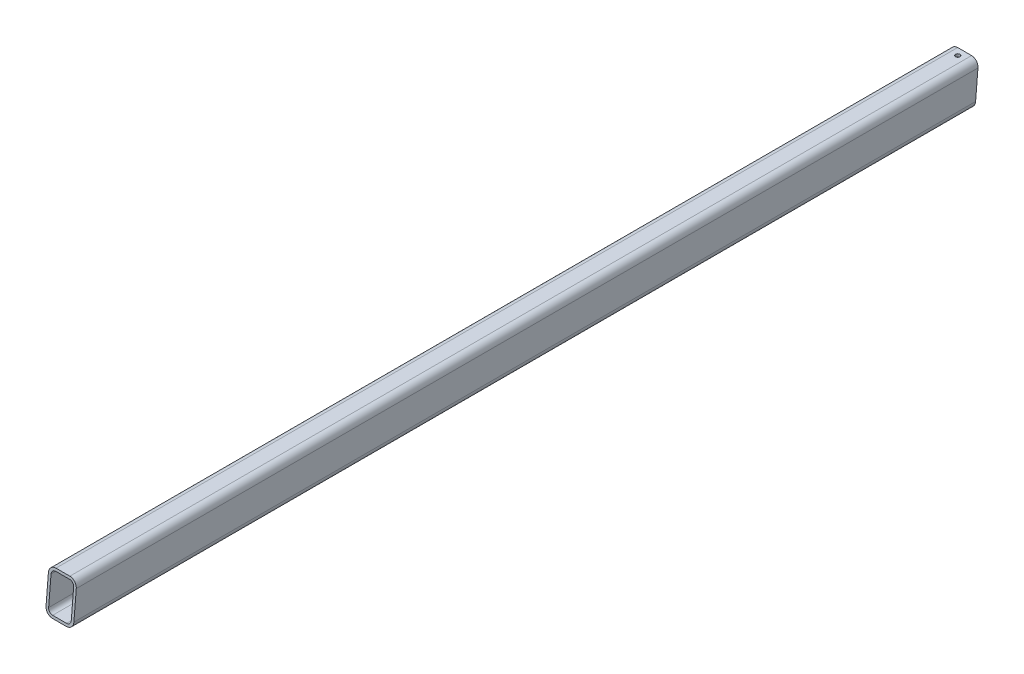
ISO-10303-21;
HEADER;
FILE_DESCRIPTION(('STEP AP214'),'2;1');
FILE_NAME('part.step','',(''),(''),'','','');
FILE_SCHEMA(('AUTOMOTIVE_DESIGN { 1 0 10303 214 1 1 1 1 }'));
ENDSEC;
DATA;
#1=APPLICATION_CONTEXT('core data for automotive mechanical design processes');
#2=APPLICATION_PROTOCOL_DEFINITION('international standard','automotive_design',2000,#1);
#3=PRODUCT_CONTEXT('',#1,'mechanical');
#4=PRODUCT('Part','Part','',(#3));
#5=PRODUCT_RELATED_PRODUCT_CATEGORY('part','',(#4));
#6=PRODUCT_DEFINITION_FORMATION('','',#4);
#7=PRODUCT_DEFINITION_CONTEXT('part definition',#1,'design');
#8=PRODUCT_DEFINITION('design','',#6,#7);
#9=PRODUCT_DEFINITION_SHAPE('','',#8);
#10=(LENGTH_UNIT() NAMED_UNIT(*) SI_UNIT(.MILLI.,.METRE.));
#11=(NAMED_UNIT(*) PLANE_ANGLE_UNIT() SI_UNIT($,.RADIAN.));
#12=(NAMED_UNIT(*) SI_UNIT($,.STERADIAN.) SOLID_ANGLE_UNIT());
#13=UNCERTAINTY_MEASURE_WITH_UNIT(LENGTH_MEASURE(1.E-05),#10,'distance_accuracy_value','');
#14=(GEOMETRIC_REPRESENTATION_CONTEXT(3) GLOBAL_UNCERTAINTY_ASSIGNED_CONTEXT((#13)) GLOBAL_UNIT_ASSIGNED_CONTEXT((#10,
#11,#12)) REPRESENTATION_CONTEXT('',''));
#15=CARTESIAN_POINT('',(0.,0.,0.));
#16=DIRECTION('',(0.,0.,1.));
#17=DIRECTION('',(1.,0.,0.));
#18=AXIS2_PLACEMENT_3D('',#15,#16,#17);
#19=CARTESIAN_POINT('',(-12.7,38.1,838.2));
#20=DIRECTION('',(0.,-1.,0.));
#21=DIRECTION('',(0.,0.,-1.));
#22=AXIS2_PLACEMENT_3D('',#19,#20,#21);
#23=PLANE('',#22);
#24=DIRECTION('',(0.,0.,-1.));
#25=VECTOR('',#24,1.);
#26=CARTESIAN_POINT('',(12.7,38.1,838.2));
#27=LINE('',#26,#25);
#28=CARTESIAN_POINT('',(12.7,38.1,818.873869568707));
#29=VERTEX_POINT('',#28);
#30=CARTESIAN_POINT('',(12.7,38.1,-825.371543987311));
#31=VERTEX_POINT('',#30);
#32=EDGE_CURVE('E215',#29,#31,#27,.T.);
#33=ORIENTED_EDGE('',*,*,#32,.T.);
#34=DIRECTION('',(-1.,0.,0.));
#35=VECTOR('',#34,1.);
#36=CARTESIAN_POINT('',(-12.7,38.1,-825.371543987311));
#37=LINE('',#36,#35);
#38=CARTESIAN_POINT('',(-12.7,38.1,-825.371543987311));
#39=VERTEX_POINT('',#38);
#40=EDGE_CURVE('E257',#31,#39,#37,.T.);
#41=ORIENTED_EDGE('',*,*,#40,.T.);
#42=DIRECTION('',(0.,0.,-1.));
#43=VECTOR('',#42,1.);
#44=CARTESIAN_POINT('',(-12.7,38.1,838.2));
#45=LINE('',#44,#43);
#46=CARTESIAN_POINT('',(-12.7,38.1,818.873869568707));
#47=VERTEX_POINT('',#46);
#48=EDGE_CURVE('E212',#47,#39,#45,.T.);
#49=ORIENTED_EDGE('',*,*,#48,.F.);
#50=DIRECTION('',(1.,0.,0.));
#51=VECTOR('',#50,1.);
#52=CARTESIAN_POINT('',(-12.7,38.1,818.873869568707));
#53=LINE('',#52,#51);
#54=EDGE_CURVE('E175',#47,#29,#53,.T.);
#55=ORIENTED_EDGE('',*,*,#54,.T.);
#56=EDGE_LOOP('',(#33,#41,#49,#55));
#57=FACE_BOUND('',#56,.T.);
#58=CARTESIAN_POINT('',(0.,38.1,-812.8));
#59=DIRECTION('',(0.,1.,0.));
#60=DIRECTION('',(0.,0.,1.));
#61=AXIS2_PLACEMENT_3D('',#58,#59,#60);
#62=CIRCLE('',#61,3.9751);
#63=CARTESIAN_POINT('',(0.,38.1,-816.7751));
#64=VERTEX_POINT('',#63);
#65=EDGE_CURVE('E230',#64,#64,#62,.T.);
#66=ORIENTED_EDGE('',*,*,#65,.F.);
#67=EDGE_LOOP('',(#66));
#68=FACE_BOUND('',#67,.T.);
#69=ADVANCED_FACE('F36',(#57,#68),#23,.F.);
#70=CARTESIAN_POINT('',(-12.7,33.3248,838.2));
#71=DIRECTION('',(0.,-1.,0.));
#72=DIRECTION('',(1.,0.,0.));
#73=AXIS2_PLACEMENT_3D('',#70,#71,#72);
#74=PLANE('',#73);
#75=DIRECTION('',(-1.,0.,0.));
#76=VECTOR('',#75,1.);
#77=CARTESIAN_POINT('',(-12.7,33.3248,-824.964356390412));
#78=LINE('',#77,#76);
#79=CARTESIAN_POINT('',(12.7,33.3248,-824.964356390412));
#80=VERTEX_POINT('',#79);
#81=CARTESIAN_POINT('',(-12.7,33.3248,-824.964356390412));
#82=VERTEX_POINT('',#81);
#83=EDGE_CURVE('E11',#80,#82,#78,.T.);
#84=ORIENTED_EDGE('',*,*,#83,.F.);
#85=DIRECTION('',(0.,0.,-1.));
#86=VECTOR('',#85,1.);
#87=CARTESIAN_POINT('',(12.7,33.3248,838.2));
#88=LINE('',#87,#86);
#89=CARTESIAN_POINT('',(12.7,33.3248,819.281057165606));
#90=VERTEX_POINT('',#89);
#91=EDGE_CURVE('E169',#90,#80,#88,.T.);
#92=ORIENTED_EDGE('',*,*,#91,.F.);
#93=DIRECTION('',(1.,0.,0.));
#94=VECTOR('',#93,1.);
#95=CARTESIAN_POINT('',(-12.7,33.3248,819.281057165606));
#96=LINE('',#95,#94);
#97=CARTESIAN_POINT('',(-12.7,33.3248,819.281057165606));
#98=VERTEX_POINT('',#97);
#99=EDGE_CURVE('E45',#98,#90,#96,.T.);
#100=ORIENTED_EDGE('',*,*,#99,.F.);
#101=DIRECTION('',(0.,0.,-1.));
#102=VECTOR('',#101,1.);
#103=CARTESIAN_POINT('',(-12.7,33.3248,838.2));
#104=LINE('',#103,#102);
#105=EDGE_CURVE('E160',#98,#82,#104,.T.);
#106=ORIENTED_EDGE('',*,*,#105,.T.);
#107=EDGE_LOOP('',(#84,#92,#100,#106));
#108=FACE_BOUND('',#107,.T.);
#109=CARTESIAN_POINT('',(0.,33.3248,-812.8));
#110=DIRECTION('',(0.,-1.,0.));
#111=DIRECTION('',(1.,0.,0.));
#112=AXIS2_PLACEMENT_3D('',#109,#110,#111);
#113=CIRCLE('',#112,3.9751);
#114=CARTESIAN_POINT('',(0.,33.3248,-816.7751));
#115=VERTEX_POINT('',#114);
#116=EDGE_CURVE('E40',#115,#115,#113,.F.);
#117=ORIENTED_EDGE('',*,*,#116,.T.);
#118=EDGE_LOOP('',(#117));
#119=FACE_BOUND('',#118,.T.);
#120=ADVANCED_FACE('F167',(#108,#119),#74,.T.);
#121=CARTESIAN_POINT('',(12.7,25.4,838.2));
#122=DIRECTION('',(0.,0.,-1.));
#123=DIRECTION('',(-1.,0.,0.));
#124=AXIS2_PLACEMENT_3D('',#121,#122,#123);
#125=CYLINDRICAL_SURFACE('',#124,12.7);
#126=DIRECTION('',(0.,0.,-1.));
#127=VECTOR('',#126,1.);
#128=CARTESIAN_POINT('',(25.4,25.4,838.2));
#129=LINE('',#128,#127);
#130=CARTESIAN_POINT('',(25.4,25.4,819.956815305141));
#131=VERTEX_POINT('',#130);
#132=CARTESIAN_POINT('',(25.4,25.4,-824.288598250877));
#133=VERTEX_POINT('',#132);
#134=EDGE_CURVE('E194',#131,#133,#129,.T.);
#135=ORIENTED_EDGE('',*,*,#134,.T.);
#136=CARTESIAN_POINT('',(12.7,25.4,-824.288598250877));
#137=DIRECTION('',(0.,0.0849629859680558,0.996384108170836));
#138=DIRECTION('',(0.,0.996384108170836,-0.0849629859680559));
#139=AXIS2_PLACEMENT_3D('',#136,#137,#138);
#140=ELLIPSE('',#139,12.7460884771784,12.7);
#141=EDGE_CURVE('E53',#133,#31,#140,.T.);
#142=ORIENTED_EDGE('',*,*,#141,.T.);
#143=ORIENTED_EDGE('',*,*,#32,.F.);
#144=CARTESIAN_POINT('',(12.7,25.4,819.956815305141));
#145=DIRECTION('',(0.,-0.0849629859680556,-0.996384108170836));
#146=DIRECTION('',(0.,0.996384108170836,-0.0849629859680556));
#147=AXIS2_PLACEMENT_3D('',#144,#145,#146);
#148=ELLIPSE('',#147,12.7460884771784,12.7);
#149=EDGE_CURVE('E170',#29,#131,#148,.T.);
#150=ORIENTED_EDGE('',*,*,#149,.T.);
#151=EDGE_LOOP('',(#135,#142,#143,#150));
#152=FACE_BOUND('',#151,.T.);
#153=ADVANCED_FACE('F38',(#152),#125,.T.);
#154=CARTESIAN_POINT('',(-12.7,25.4,838.2));
#155=DIRECTION('',(0.,0.,-1.));
#156=DIRECTION('',(-1.,0.,0.));
#157=AXIS2_PLACEMENT_3D('',#154,#155,#156);
#158=CYLINDRICAL_SURFACE('',#157,12.7);
#159=ORIENTED_EDGE('',*,*,#48,.T.);
#160=CARTESIAN_POINT('',(-12.7,25.4,-824.288598250877));
#161=DIRECTION('',(0.,0.0849629859680558,0.996384108170836));
#162=DIRECTION('',(0.,0.996384108170836,-0.0849629859680559));
#163=AXIS2_PLACEMENT_3D('',#160,#161,#162);
#164=ELLIPSE('',#163,12.7460884771784,12.7);
#165=CARTESIAN_POINT('',(-25.4,25.4,-824.288598250877));
#166=VERTEX_POINT('',#165);
#167=EDGE_CURVE('E254',#39,#166,#164,.T.);
#168=ORIENTED_EDGE('',*,*,#167,.T.);
#169=DIRECTION('',(0.,0.,-1.));
#170=VECTOR('',#169,1.);
#171=CARTESIAN_POINT('',(-25.4,25.4,838.2));
#172=LINE('',#171,#170);
#173=CARTESIAN_POINT('',(-25.4,25.4,819.956815305141));
#174=VERTEX_POINT('',#173);
#175=EDGE_CURVE('E209',#174,#166,#172,.T.);
#176=ORIENTED_EDGE('',*,*,#175,.F.);
#177=CARTESIAN_POINT('',(-12.7,25.4,819.956815305141));
#178=DIRECTION('',(0.,-0.0849629859680556,-0.996384108170836));
#179=DIRECTION('',(0.,0.996384108170836,-0.0849629859680556));
#180=AXIS2_PLACEMENT_3D('',#177,#178,#179);
#181=ELLIPSE('',#180,12.7460884771784,12.7);
#182=EDGE_CURVE('E290',#174,#47,#181,.T.);
#183=ORIENTED_EDGE('',*,*,#182,.T.);
#184=EDGE_LOOP('',(#159,#168,#176,#183));
#185=FACE_BOUND('',#184,.T.);
#186=ADVANCED_FACE('F316',(#185),#158,.T.);
#187=CARTESIAN_POINT('',(-25.4,25.4,838.2));
#188=DIRECTION('',(1.,0.,0.));
#189=DIRECTION('',(0.,0.,-1.));
#190=AXIS2_PLACEMENT_3D('',#187,#188,#189);
#191=PLANE('',#190);
#192=ORIENTED_EDGE('',*,*,#175,.T.);
#193=DIRECTION('',(0.,-0.996384108170836,0.0849629859680559));
#194=VECTOR('',#193,1.);
#195=CARTESIAN_POINT('',(-25.4,-115.339250740842,-812.287576869875));
#196=LINE('',#195,#194);
#197=CARTESIAN_POINT('',(-25.4,-25.4,-819.95681530514));
#198=VERTEX_POINT('',#197);
#199=EDGE_CURVE('E251',#166,#198,#196,.T.);
#200=ORIENTED_EDGE('',*,*,#199,.T.);
#201=DIRECTION('',(0.,0.,-1.));
#202=VECTOR('',#201,1.);
#203=CARTESIAN_POINT('',(-25.4,-25.4,838.2));
#204=LINE('',#203,#202);
#205=CARTESIAN_POINT('',(-25.4,-25.4,824.288598250877));
#206=VERTEX_POINT('',#205);
#207=EDGE_CURVE('E206',#206,#198,#204,.T.);
#208=ORIENTED_EDGE('',*,*,#207,.F.);
#209=DIRECTION('',(0.,0.996384108170836,-0.0849629859680556));
#210=VECTOR('',#209,1.);
#211=CARTESIAN_POINT('',(-25.4,23.8556091706237,820.088507546405));
#212=LINE('',#211,#210);
#213=EDGE_CURVE('E287',#206,#174,#212,.T.);
#214=ORIENTED_EDGE('',*,*,#213,.T.);
#215=EDGE_LOOP('',(#192,#200,#208,#214));
#216=FACE_BOUND('',#215,.T.);
#217=ADVANCED_FACE('F313',(#216),#191,.F.);
#218=CARTESIAN_POINT('',(-12.7,-25.4,838.2));
#219=DIRECTION('',(0.,0.,-1.));
#220=DIRECTION('',(-1.,0.,0.));
#221=AXIS2_PLACEMENT_3D('',#218,#219,#220);
#222=CYLINDRICAL_SURFACE('',#221,12.7);
#223=ORIENTED_EDGE('',*,*,#207,.T.);
#224=CARTESIAN_POINT('',(-12.7,-25.4,-819.95681530514));
#225=DIRECTION('',(0.,0.0849629859680558,0.996384108170836));
#226=DIRECTION('',(0.,0.996384108170836,-0.0849629859680559));
#227=AXIS2_PLACEMENT_3D('',#224,#225,#226);
#228=ELLIPSE('',#227,12.7460884771784,12.7);
#229=CARTESIAN_POINT('',(-12.7,-38.1,-818.873869568706));
#230=VERTEX_POINT('',#229);
#231=EDGE_CURVE('E248',#198,#230,#228,.T.);
#232=ORIENTED_EDGE('',*,*,#231,.T.);
#233=DIRECTION('',(0.,0.,-1.));
#234=VECTOR('',#233,1.);
#235=CARTESIAN_POINT('',(-12.7,-38.1,838.2));
#236=LINE('',#235,#234);
#237=CARTESIAN_POINT('',(-12.7,-38.1,825.371543987311));
#238=VERTEX_POINT('',#237);
#239=EDGE_CURVE('E203',#238,#230,#236,.T.);
#240=ORIENTED_EDGE('',*,*,#239,.F.);
#241=CARTESIAN_POINT('',(-12.7,-25.4,824.288598250877));
#242=DIRECTION('',(0.,-0.0849629859680556,-0.996384108170836));
#243=DIRECTION('',(0.,0.996384108170836,-0.0849629859680556));
#244=AXIS2_PLACEMENT_3D('',#241,#242,#243);
#245=ELLIPSE('',#244,12.7460884771784,12.7);
#246=EDGE_CURVE('E284',#238,#206,#245,.T.);
#247=ORIENTED_EDGE('',*,*,#246,.T.);
#248=EDGE_LOOP('',(#223,#232,#240,#247));
#249=FACE_BOUND('',#248,.T.);
#250=ADVANCED_FACE('F310',(#249),#222,.T.);
#251=CARTESIAN_POINT('',(-12.7,-38.1,838.2));
#252=DIRECTION('',(0.,1.,0.));
#253=DIRECTION('',(0.,0.,1.));
#254=AXIS2_PLACEMENT_3D('',#251,#252,#253);
#255=PLANE('',#254);
#256=CARTESIAN_POINT('',(0.,-38.1,-806.45));
#257=DIRECTION('',(0.,1.,0.));
#258=DIRECTION('',(0.,0.,1.));
#259=AXIS2_PLACEMENT_3D('',#256,#257,#258);
#260=CIRCLE('',#259,3.97510000000001);
#261=CARTESIAN_POINT('',(0.,-38.1,-802.4749));
#262=VERTEX_POINT('',#261);
#263=EDGE_CURVE('E220',#262,#262,#260,.T.);
#264=ORIENTED_EDGE('',*,*,#263,.T.);
#265=EDGE_LOOP('',(#264));
#266=FACE_BOUND('',#265,.T.);
#267=ORIENTED_EDGE('',*,*,#239,.T.);
#268=DIRECTION('',(1.,0.,0.));
#269=VECTOR('',#268,1.);
#270=CARTESIAN_POINT('',(-12.7,-38.1,-818.873869568706));
#271=LINE('',#270,#269);
#272=CARTESIAN_POINT('',(12.7,-38.1,-818.873869568706));
#273=VERTEX_POINT('',#272);
#274=EDGE_CURVE('E245',#230,#273,#271,.T.);
#275=ORIENTED_EDGE('',*,*,#274,.T.);
#276=DIRECTION('',(0.,0.,-1.));
#277=VECTOR('',#276,1.);
#278=CARTESIAN_POINT('',(12.7,-38.1,838.2));
#279=LINE('',#278,#277);
#280=CARTESIAN_POINT('',(12.7,-38.1,825.371543987311));
#281=VERTEX_POINT('',#280);
#282=EDGE_CURVE('E200',#281,#273,#279,.T.);
#283=ORIENTED_EDGE('',*,*,#282,.F.);
#284=DIRECTION('',(-1.,0.,0.));
#285=VECTOR('',#284,1.);
#286=CARTESIAN_POINT('',(-12.7,-38.1,825.371543987311));
#287=LINE('',#286,#285);
#288=EDGE_CURVE('E281',#281,#238,#287,.T.);
#289=ORIENTED_EDGE('',*,*,#288,.T.);
#290=EDGE_LOOP('',(#267,#275,#283,#289));
#291=FACE_BOUND('',#290,.T.);
#292=ADVANCED_FACE('F307',(#266,#291),#255,.F.);
#293=CARTESIAN_POINT('',(12.7,-25.4,838.2));
#294=DIRECTION('',(0.,0.,-1.));
#295=DIRECTION('',(-1.,0.,0.));
#296=AXIS2_PLACEMENT_3D('',#293,#294,#295);
#297=CYLINDRICAL_SURFACE('',#296,12.7);
#298=ORIENTED_EDGE('',*,*,#282,.T.);
#299=CARTESIAN_POINT('',(12.7,-25.4,-819.95681530514));
#300=DIRECTION('',(0.,0.0849629859680558,0.996384108170836));
#301=DIRECTION('',(0.,0.996384108170836,-0.0849629859680559));
#302=AXIS2_PLACEMENT_3D('',#299,#300,#301);
#303=ELLIPSE('',#302,12.7460884771784,12.7);
#304=CARTESIAN_POINT('',(25.4,-25.4,-819.956815305141));
#305=VERTEX_POINT('',#304);
#306=EDGE_CURVE('E242',#273,#305,#303,.T.);
#307=ORIENTED_EDGE('',*,*,#306,.T.);
#308=DIRECTION('',(0.,0.,-1.));
#309=VECTOR('',#308,1.);
#310=CARTESIAN_POINT('',(25.4,-25.4,838.2));
#311=LINE('',#310,#309);
#312=CARTESIAN_POINT('',(25.4,-25.4,824.288598250877));
#313=VERTEX_POINT('',#312);
#314=EDGE_CURVE('E197',#313,#305,#311,.T.);
#315=ORIENTED_EDGE('',*,*,#314,.F.);
#316=CARTESIAN_POINT('',(12.7,-25.4,824.288598250877));
#317=DIRECTION('',(0.,-0.0849629859680556,-0.996384108170836));
#318=DIRECTION('',(0.,0.996384108170836,-0.0849629859680556));
#319=AXIS2_PLACEMENT_3D('',#316,#317,#318);
#320=ELLIPSE('',#319,12.7460884771784,12.7);
#321=EDGE_CURVE('E278',#313,#281,#320,.T.);
#322=ORIENTED_EDGE('',*,*,#321,.T.);
#323=EDGE_LOOP('',(#298,#307,#315,#322));
#324=FACE_BOUND('',#323,.T.);
#325=ADVANCED_FACE('F304',(#324),#297,.T.);
#326=CARTESIAN_POINT('',(25.4,25.4,838.2));
#327=DIRECTION('',(-1.,0.,0.));
#328=DIRECTION('',(0.,0.,1.));
#329=AXIS2_PLACEMENT_3D('',#326,#327,#328);
#330=PLANE('',#329);
#331=ORIENTED_EDGE('',*,*,#314,.T.);
#332=DIRECTION('',(0.,0.996384108170836,-0.0849629859680559));
#333=VECTOR('',#332,1.);
#334=CARTESIAN_POINT('',(25.4,-115.339250740842,-812.287576869875));
#335=LINE('',#334,#333);
#336=EDGE_CURVE('E163',#305,#133,#335,.T.);
#337=ORIENTED_EDGE('',*,*,#336,.T.);
#338=ORIENTED_EDGE('',*,*,#134,.F.);
#339=DIRECTION('',(0.,-0.996384108170836,0.0849629859680556));
#340=VECTOR('',#339,1.);
#341=CARTESIAN_POINT('',(25.4,23.8556091706237,820.088507546405));
#342=LINE('',#341,#340);
#343=EDGE_CURVE('E275',#131,#313,#342,.T.);
#344=ORIENTED_EDGE('',*,*,#343,.T.);
#345=EDGE_LOOP('',(#331,#337,#338,#344));
#346=FACE_BOUND('',#345,.T.);
#347=ADVANCED_FACE('F301',(#346),#330,.F.);
#348=CARTESIAN_POINT('',(-12.7,25.4,838.2));
#349=DIRECTION('',(0.,0.,-1.));
#350=DIRECTION('',(-1.,0.,0.));
#351=AXIS2_PLACEMENT_3D('',#348,#349,#350);
#352=CYLINDRICAL_SURFACE('',#351,7.92479999999999);
#353=CARTESIAN_POINT('',(-12.7,25.4,-824.288598250877));
#354=DIRECTION('',(0.,0.0849629859680558,0.996384108170836));
#355=DIRECTION('',(0.,0.996384108170836,-0.0849629859680559));
#356=AXIS2_PLACEMENT_3D('',#353,#354,#355);
#357=ELLIPSE('',#356,7.95355920975934,7.92479999999999);
#358=CARTESIAN_POINT('',(-20.6248,25.4,-824.288598250877));
#359=VERTEX_POINT('',#358);
#360=EDGE_CURVE('E149',#82,#359,#357,.T.);
#361=ORIENTED_EDGE('',*,*,#360,.F.);
#362=ORIENTED_EDGE('',*,*,#105,.F.);
#363=CARTESIAN_POINT('',(-12.7,25.4,819.956815305141));
#364=DIRECTION('',(0.,-0.0849629859680556,-0.996384108170836));
#365=DIRECTION('',(0.,0.996384108170836,-0.0849629859680556));
#366=AXIS2_PLACEMENT_3D('',#363,#364,#365);
#367=ELLIPSE('',#366,7.95355920975933,7.92479999999999);
#368=CARTESIAN_POINT('',(-20.6248,25.4,819.956815305141));
#369=VERTEX_POINT('',#368);
#370=EDGE_CURVE('E273',#369,#98,#367,.T.);
#371=ORIENTED_EDGE('',*,*,#370,.F.);
#372=DIRECTION('',(0.,0.,-1.));
#373=VECTOR('',#372,1.);
#374=CARTESIAN_POINT('',(-20.6248,25.4,838.2));
#375=LINE('',#374,#373);
#376=EDGE_CURVE('E162',#369,#359,#375,.T.);
#377=ORIENTED_EDGE('',*,*,#376,.T.);
#378=EDGE_LOOP('',(#361,#362,#371,#377));
#379=FACE_BOUND('',#378,.T.);
#380=ADVANCED_FACE('F158',(#379),#352,.F.);
#381=CARTESIAN_POINT('',(-20.6248,25.4,838.2));
#382=DIRECTION('',(1.,0.,0.));
#383=DIRECTION('',(0.,1.,0.));
#384=AXIS2_PLACEMENT_3D('',#381,#382,#383);
#385=PLANE('',#384);
#386=DIRECTION('',(0.,-0.996384108170836,0.0849629859680559));
#387=VECTOR('',#386,1.);
#388=CARTESIAN_POINT('',(-20.6248,-115.339250740842,-812.287576869875));
#389=LINE('',#388,#387);
#390=CARTESIAN_POINT('',(-20.6248,-25.4,-819.95681530514));
#391=VERTEX_POINT('',#390);
#392=EDGE_CURVE('E164',#359,#391,#389,.T.);
#393=ORIENTED_EDGE('',*,*,#392,.F.);
#394=ORIENTED_EDGE('',*,*,#376,.F.);
#395=DIRECTION('',(0.,0.996384108170836,-0.0849629859680556));
#396=VECTOR('',#395,1.);
#397=CARTESIAN_POINT('',(-20.6248,23.8556091706237,820.088507546405));
#398=LINE('',#397,#396);
#399=CARTESIAN_POINT('',(-20.6248,-25.4,824.288598250877));
#400=VERTEX_POINT('',#399);
#401=EDGE_CURVE('E271',#400,#369,#398,.T.);
#402=ORIENTED_EDGE('',*,*,#401,.F.);
#403=DIRECTION('',(0.,0.,-1.));
#404=VECTOR('',#403,1.);
#405=CARTESIAN_POINT('',(-20.6248,-25.4,838.2));
#406=LINE('',#405,#404);
#407=EDGE_CURVE('E190',#400,#391,#406,.T.);
#408=ORIENTED_EDGE('',*,*,#407,.T.);
#409=EDGE_LOOP('',(#393,#394,#402,#408));
#410=FACE_BOUND('',#409,.T.);
#411=ADVANCED_FACE('F351',(#410),#385,.T.);
#412=CARTESIAN_POINT('',(-12.7,-25.4,838.2));
#413=DIRECTION('',(0.,0.,-1.));
#414=DIRECTION('',(-1.,0.,0.));
#415=AXIS2_PLACEMENT_3D('',#412,#413,#414);
#416=CYLINDRICAL_SURFACE('',#415,7.9248);
#417=CARTESIAN_POINT('',(-12.7,-25.4,-819.95681530514));
#418=DIRECTION('',(0.,0.0849629859680558,0.996384108170836));
#419=DIRECTION('',(0.,0.996384108170836,-0.0849629859680559));
#420=AXIS2_PLACEMENT_3D('',#417,#418,#419);
#421=ELLIPSE('',#420,7.95355920975934,7.9248);
#422=CARTESIAN_POINT('',(-12.7,-33.3248,-819.281057165606));
#423=VERTEX_POINT('',#422);
#424=EDGE_CURVE('E238',#391,#423,#421,.T.);
#425=ORIENTED_EDGE('',*,*,#424,.F.);
#426=ORIENTED_EDGE('',*,*,#407,.F.);
#427=CARTESIAN_POINT('',(-12.7,-25.4,824.288598250877));
#428=DIRECTION('',(0.,-0.0849629859680556,-0.996384108170836));
#429=DIRECTION('',(0.,0.996384108170836,-0.0849629859680556));
#430=AXIS2_PLACEMENT_3D('',#427,#428,#429);
#431=ELLIPSE('',#430,7.95355920975934,7.9248);
#432=CARTESIAN_POINT('',(-12.7,-33.3248,824.964356390412));
#433=VERTEX_POINT('',#432);
#434=EDGE_CURVE('E269',#433,#400,#431,.T.);
#435=ORIENTED_EDGE('',*,*,#434,.F.);
#436=DIRECTION('',(0.,0.,-1.));
#437=VECTOR('',#436,1.);
#438=CARTESIAN_POINT('',(-12.7,-33.3248,838.2));
#439=LINE('',#438,#437);
#440=EDGE_CURVE('E187',#433,#423,#439,.T.);
#441=ORIENTED_EDGE('',*,*,#440,.T.);
#442=EDGE_LOOP('',(#425,#426,#435,#441));
#443=FACE_BOUND('',#442,.T.);
#444=ADVANCED_FACE('F354',(#443),#416,.F.);
#445=CARTESIAN_POINT('',(-12.7,-33.3248,838.2));
#446=DIRECTION('',(0.,1.,0.));
#447=DIRECTION('',(-1.,0.,0.));
#448=AXIS2_PLACEMENT_3D('',#445,#446,#447);
#449=PLANE('',#448);
#450=CARTESIAN_POINT('',(0.,-33.3248,-806.45));
#451=DIRECTION('',(0.,1.,0.));
#452=DIRECTION('',(-1.,0.,0.));
#453=AXIS2_PLACEMENT_3D('',#450,#451,#452);
#454=CIRCLE('',#453,3.97510000000001);
#455=CARTESIAN_POINT('',(0.,-33.3248,-802.4749));
#456=VERTEX_POINT('',#455);
#457=EDGE_CURVE('E218',#456,#456,#454,.T.);
#458=ORIENTED_EDGE('',*,*,#457,.F.);
#459=EDGE_LOOP('',(#458));
#460=FACE_BOUND('',#459,.T.);
#461=DIRECTION('',(1.,0.,0.));
#462=VECTOR('',#461,1.);
#463=CARTESIAN_POINT('',(-12.7,-33.3248,-819.281057165606));
#464=LINE('',#463,#462);
#465=CARTESIAN_POINT('',(12.7,-33.3248,-819.281057165606));
#466=VERTEX_POINT('',#465);
#467=EDGE_CURVE('E236',#423,#466,#464,.T.);
#468=ORIENTED_EDGE('',*,*,#467,.F.);
#469=ORIENTED_EDGE('',*,*,#440,.F.);
#470=DIRECTION('',(-1.,0.,0.));
#471=VECTOR('',#470,1.);
#472=CARTESIAN_POINT('',(-12.7,-33.3248,824.964356390412));
#473=LINE('',#472,#471);
#474=CARTESIAN_POINT('',(12.7,-33.3248,824.964356390412));
#475=VERTEX_POINT('',#474);
#476=EDGE_CURVE('E267',#475,#433,#473,.T.);
#477=ORIENTED_EDGE('',*,*,#476,.F.);
#478=DIRECTION('',(0.,0.,-1.));
#479=VECTOR('',#478,1.);
#480=CARTESIAN_POINT('',(12.7,-33.3248,838.2));
#481=LINE('',#480,#479);
#482=EDGE_CURVE('E184',#475,#466,#481,.T.);
#483=ORIENTED_EDGE('',*,*,#482,.T.);
#484=EDGE_LOOP('',(#468,#469,#477,#483));
#485=FACE_BOUND('',#484,.T.);
#486=ADVANCED_FACE('F358',(#460,#485),#449,.T.);
#487=CARTESIAN_POINT('',(12.7,-25.4,838.2));
#488=DIRECTION('',(0.,0.,-1.));
#489=DIRECTION('',(-1.,0.,0.));
#490=AXIS2_PLACEMENT_3D('',#487,#488,#489);
#491=CYLINDRICAL_SURFACE('',#490,7.92479999999999);
#492=CARTESIAN_POINT('',(12.7,-25.4,-819.95681530514));
#493=DIRECTION('',(0.,0.0849629859680558,0.996384108170836));
#494=DIRECTION('',(0.,0.996384108170836,-0.0849629859680559));
#495=AXIS2_PLACEMENT_3D('',#492,#493,#494);
#496=ELLIPSE('',#495,7.95355920975933,7.92479999999999);
#497=CARTESIAN_POINT('',(20.6248,-25.4,-819.956815305141));
#498=VERTEX_POINT('',#497);
#499=EDGE_CURVE('E234',#466,#498,#496,.T.);
#500=ORIENTED_EDGE('',*,*,#499,.F.);
#501=ORIENTED_EDGE('',*,*,#482,.F.);
#502=CARTESIAN_POINT('',(12.7,-25.4,824.288598250877));
#503=DIRECTION('',(0.,-0.0849629859680556,-0.996384108170836));
#504=DIRECTION('',(0.,0.996384108170836,-0.0849629859680556));
#505=AXIS2_PLACEMENT_3D('',#502,#503,#504);
#506=ELLIPSE('',#505,7.95355920975933,7.92479999999999);
#507=CARTESIAN_POINT('',(20.6248,-25.4,824.288598250877));
#508=VERTEX_POINT('',#507);
#509=EDGE_CURVE('E265',#508,#475,#506,.T.);
#510=ORIENTED_EDGE('',*,*,#509,.F.);
#511=DIRECTION('',(0.,0.,-1.));
#512=VECTOR('',#511,1.);
#513=CARTESIAN_POINT('',(20.6248,-25.4,838.2));
#514=LINE('',#513,#512);
#515=EDGE_CURVE('E181',#508,#498,#514,.T.);
#516=ORIENTED_EDGE('',*,*,#515,.T.);
#517=EDGE_LOOP('',(#500,#501,#510,#516));
#518=FACE_BOUND('',#517,.T.);
#519=ADVANCED_FACE('F362',(#518),#491,.F.);
#520=CARTESIAN_POINT('',(20.6248,25.4,838.2));
#521=DIRECTION('',(-1.,0.,0.));
#522=DIRECTION('',(0.,-1.,0.));
#523=AXIS2_PLACEMENT_3D('',#520,#521,#522);
#524=PLANE('',#523);
#525=DIRECTION('',(0.,0.996384108170836,-0.0849629859680559));
#526=VECTOR('',#525,1.);
#527=CARTESIAN_POINT('',(20.6248,-115.339250740842,-812.287576869875));
#528=LINE('',#527,#526);
#529=CARTESIAN_POINT('',(20.6248,25.4,-824.288598250877));
#530=VERTEX_POINT('',#529);
#531=EDGE_CURVE('E223',#498,#530,#528,.T.);
#532=ORIENTED_EDGE('',*,*,#531,.F.);
#533=ORIENTED_EDGE('',*,*,#515,.F.);
#534=DIRECTION('',(0.,-0.996384108170836,0.0849629859680556));
#535=VECTOR('',#534,1.);
#536=CARTESIAN_POINT('',(20.6248,23.8556091706237,820.088507546405));
#537=LINE('',#536,#535);
#538=CARTESIAN_POINT('',(20.6248,25.4,819.956815305141));
#539=VERTEX_POINT('',#538);
#540=EDGE_CURVE('E263',#539,#508,#537,.T.);
#541=ORIENTED_EDGE('',*,*,#540,.F.);
#542=DIRECTION('',(0.,0.,-1.));
#543=VECTOR('',#542,1.);
#544=CARTESIAN_POINT('',(20.6248,25.4,838.2));
#545=LINE('',#544,#543);
#546=EDGE_CURVE('E172',#539,#530,#545,.T.);
#547=ORIENTED_EDGE('',*,*,#546,.T.);
#548=EDGE_LOOP('',(#532,#533,#541,#547));
#549=FACE_BOUND('',#548,.T.);
#550=ADVANCED_FACE('F328',(#549),#524,.T.);
#551=CARTESIAN_POINT('',(12.7,25.4,838.2));
#552=DIRECTION('',(0.,0.,-1.));
#553=DIRECTION('',(-1.,0.,0.));
#554=AXIS2_PLACEMENT_3D('',#551,#552,#553);
#555=CYLINDRICAL_SURFACE('',#554,7.9248);
#556=CARTESIAN_POINT('',(12.7,25.4,-824.288598250877));
#557=DIRECTION('',(0.,0.0849629859680558,0.996384108170836));
#558=DIRECTION('',(0.,0.996384108170836,-0.0849629859680559));
#559=AXIS2_PLACEMENT_3D('',#556,#557,#558);
#560=ELLIPSE('',#559,7.95355920975934,7.9248);
#561=EDGE_CURVE('E60',#530,#80,#560,.T.);
#562=ORIENTED_EDGE('',*,*,#561,.F.);
#563=ORIENTED_EDGE('',*,*,#546,.F.);
#564=CARTESIAN_POINT('',(12.7,25.4,819.956815305141));
#565=DIRECTION('',(0.,-0.0849629859680556,-0.996384108170836));
#566=DIRECTION('',(0.,0.996384108170836,-0.0849629859680556));
#567=AXIS2_PLACEMENT_3D('',#564,#565,#566);
#568=ELLIPSE('',#567,7.95355920975934,7.9248);
#569=EDGE_CURVE('E261',#90,#539,#568,.T.);
#570=ORIENTED_EDGE('',*,*,#569,.F.);
#571=ORIENTED_EDGE('',*,*,#91,.T.);
#572=EDGE_LOOP('',(#562,#563,#570,#571));
#573=FACE_BOUND('',#572,.T.);
#574=ADVANCED_FACE('F319',(#573),#555,.F.);
#575=CARTESIAN_POINT('',(-38.1,121.113483343034,811.795200446433));
#576=DIRECTION('',(0.,-0.0849629859680556,-0.996384108170836));
#577=DIRECTION('',(0.,0.996384108170836,-0.0849629859680556));
#578=AXIS2_PLACEMENT_3D('',#575,#576,#577);
#579=PLANE('',#578);
#580=ORIENTED_EDGE('',*,*,#370,.T.);
#581=ORIENTED_EDGE('',*,*,#99,.T.);
#582=ORIENTED_EDGE('',*,*,#569,.T.);
#583=ORIENTED_EDGE('',*,*,#540,.T.);
#584=ORIENTED_EDGE('',*,*,#509,.T.);
#585=ORIENTED_EDGE('',*,*,#476,.T.);
#586=ORIENTED_EDGE('',*,*,#434,.T.);
#587=ORIENTED_EDGE('',*,*,#401,.T.);
#588=EDGE_LOOP('',(#580,#581,#582,#583,#584,#585,#586,#587));
#589=FACE_BOUND('',#588,.T.);
#590=ORIENTED_EDGE('',*,*,#54,.F.);
#591=ORIENTED_EDGE('',*,*,#182,.F.);
#592=ORIENTED_EDGE('',*,*,#213,.F.);
#593=ORIENTED_EDGE('',*,*,#246,.F.);
#594=ORIENTED_EDGE('',*,*,#288,.F.);
#595=ORIENTED_EDGE('',*,*,#321,.F.);
#596=ORIENTED_EDGE('',*,*,#343,.F.);
#597=ORIENTED_EDGE('',*,*,#149,.F.);
#598=EDGE_LOOP('',(#590,#591,#592,#593,#594,#595,#596,#597));
#599=FACE_BOUND('',#598,.T.);
#600=ADVANCED_FACE('F317',(#589,#599),#579,.F.);
#601=CARTESIAN_POINT('',(-38.1,128.994953343828,-833.122276442986));
#602=DIRECTION('',(0.,0.0849629859680558,0.996384108170836));
#603=DIRECTION('',(0.,-0.996384108170836,0.0849629859680559));
#604=AXIS2_PLACEMENT_3D('',#601,#602,#603);
#605=PLANE('',#604);
#606=ORIENTED_EDGE('',*,*,#360,.T.);
#607=ORIENTED_EDGE('',*,*,#392,.T.);
#608=ORIENTED_EDGE('',*,*,#424,.T.);
#609=ORIENTED_EDGE('',*,*,#467,.T.);
#610=ORIENTED_EDGE('',*,*,#499,.T.);
#611=ORIENTED_EDGE('',*,*,#531,.T.);
#612=ORIENTED_EDGE('',*,*,#561,.T.);
#613=ORIENTED_EDGE('',*,*,#83,.T.);
#614=EDGE_LOOP('',(#606,#607,#608,#609,#610,#611,#612,#613));
#615=FACE_BOUND('',#614,.T.);
#616=ORIENTED_EDGE('',*,*,#336,.F.);
#617=ORIENTED_EDGE('',*,*,#306,.F.);
#618=ORIENTED_EDGE('',*,*,#274,.F.);
#619=ORIENTED_EDGE('',*,*,#231,.F.);
#620=ORIENTED_EDGE('',*,*,#199,.F.);
#621=ORIENTED_EDGE('',*,*,#167,.F.);
#622=ORIENTED_EDGE('',*,*,#40,.F.);
#623=ORIENTED_EDGE('',*,*,#141,.F.);
#624=EDGE_LOOP('',(#616,#617,#618,#619,#620,#621,#622,#623));
#625=FACE_BOUND('',#624,.T.);
#626=ADVANCED_FACE('F148',(#615,#625),#605,.F.);
#627=CARTESIAN_POINT('',(0.,-38.1,-806.45));
#628=DIRECTION('',(0.,1.,0.));
#629=DIRECTION('',(0.,0.,1.));
#630=AXIS2_PLACEMENT_3D('',#627,#628,#629);
#631=CYLINDRICAL_SURFACE('',#630,3.97510000000001);
#632=CARTESIAN_POINT('',(0.,-33.3248,-802.4749));
#633=CARTESIAN_POINT('',(0.,-33.3745416666667,-802.4749));
#634=CARTESIAN_POINT('',(0.,-33.4242833333333,-802.4749));
#635=CARTESIAN_POINT('',(0.,-33.5237666666667,-802.4749));
#636=CARTESIAN_POINT('',(0.,-33.5735083333333,-802.4749));
#637=CARTESIAN_POINT('',(0.,-33.6729916666667,-802.4749));
#638=CARTESIAN_POINT('',(0.,-33.7227333333333,-802.4749));
#639=CARTESIAN_POINT('',(0.,-33.8222166666667,-802.4749));
#640=CARTESIAN_POINT('',(0.,-33.8719583333333,-802.4749));
#641=CARTESIAN_POINT('',(0.,-33.9714416666667,-802.4749));
#642=CARTESIAN_POINT('',(0.,-34.0211833333333,-802.4749));
#643=CARTESIAN_POINT('',(0.,-34.1206666666667,-802.4749));
#644=CARTESIAN_POINT('',(0.,-34.1704083333333,-802.4749));
#645=CARTESIAN_POINT('',(0.,-34.2698916666667,-802.4749));
#646=CARTESIAN_POINT('',(0.,-34.3196333333333,-802.4749));
#647=CARTESIAN_POINT('',(0.,-34.4191166666667,-802.4749));
#648=CARTESIAN_POINT('',(0.,-34.4688583333333,-802.4749));
#649=CARTESIAN_POINT('',(0.,-34.5683416666667,-802.4749));
#650=CARTESIAN_POINT('',(0.,-34.6180833333333,-802.4749));
#651=CARTESIAN_POINT('',(0.,-34.7175666666667,-802.4749));
#652=CARTESIAN_POINT('',(0.,-34.7673083333333,-802.4749));
#653=CARTESIAN_POINT('',(0.,-34.8667916666667,-802.4749));
#654=CARTESIAN_POINT('',(0.,-34.9165333333333,-802.4749));
#655=CARTESIAN_POINT('',(0.,-35.0160166666667,-802.4749));
#656=CARTESIAN_POINT('',(0.,-35.0657583333333,-802.4749));
#657=CARTESIAN_POINT('',(0.,-35.1652416666667,-802.4749));
#658=CARTESIAN_POINT('',(0.,-35.2149833333333,-802.4749));
#659=CARTESIAN_POINT('',(0.,-35.3144666666667,-802.4749));
#660=CARTESIAN_POINT('',(0.,-35.3642083333333,-802.4749));
#661=CARTESIAN_POINT('',(0.,-35.4636916666667,-802.4749));
#662=CARTESIAN_POINT('',(0.,-35.5134333333333,-802.4749));
#663=CARTESIAN_POINT('',(0.,-35.6129166666667,-802.4749));
#664=CARTESIAN_POINT('',(0.,-35.6626583333333,-802.4749));
#665=CARTESIAN_POINT('',(0.,-35.7621416666667,-802.4749));
#666=CARTESIAN_POINT('',(0.,-35.8118833333333,-802.4749));
#667=CARTESIAN_POINT('',(0.,-35.9113666666667,-802.4749));
#668=CARTESIAN_POINT('',(0.,-35.9611083333333,-802.4749));
#669=CARTESIAN_POINT('',(0.,-36.0605916666667,-802.4749));
#670=CARTESIAN_POINT('',(0.,-36.1103333333333,-802.4749));
#671=CARTESIAN_POINT('',(0.,-36.2098166666667,-802.4749));
#672=CARTESIAN_POINT('',(0.,-36.2595583333333,-802.4749));
#673=CARTESIAN_POINT('',(0.,-36.3590416666667,-802.4749));
#674=CARTESIAN_POINT('',(0.,-36.4087833333333,-802.4749));
#675=CARTESIAN_POINT('',(0.,-36.5082666666667,-802.4749));
#676=CARTESIAN_POINT('',(0.,-36.5580083333333,-802.4749));
#677=CARTESIAN_POINT('',(0.,-36.6574916666667,-802.4749));
#678=CARTESIAN_POINT('',(0.,-36.7072333333333,-802.4749));
#679=CARTESIAN_POINT('',(0.,-36.8067166666667,-802.4749));
#680=CARTESIAN_POINT('',(0.,-36.8564583333333,-802.4749));
#681=CARTESIAN_POINT('',(0.,-36.9559416666667,-802.4749));
#682=CARTESIAN_POINT('',(0.,-37.0056833333333,-802.4749));
#683=CARTESIAN_POINT('',(0.,-37.1051666666667,-802.4749));
#684=CARTESIAN_POINT('',(0.,-37.1549083333333,-802.4749));
#685=CARTESIAN_POINT('',(0.,-37.2543916666667,-802.4749));
#686=CARTESIAN_POINT('',(0.,-37.3041333333333,-802.4749));
#687=CARTESIAN_POINT('',(0.,-37.4036166666667,-802.4749));
#688=CARTESIAN_POINT('',(0.,-37.4533583333333,-802.4749));
#689=CARTESIAN_POINT('',(0.,-37.5528416666667,-802.4749));
#690=CARTESIAN_POINT('',(0.,-37.6025833333333,-802.4749));
#691=CARTESIAN_POINT('',(0.,-37.7020666666667,-802.4749));
#692=CARTESIAN_POINT('',(0.,-37.7518083333333,-802.4749));
#693=CARTESIAN_POINT('',(0.,-37.8512916666667,-802.4749));
#694=CARTESIAN_POINT('',(0.,-37.9010333333333,-802.4749));
#695=CARTESIAN_POINT('',(0.,-38.0005166666667,-802.4749));
#696=CARTESIAN_POINT('',(0.,-38.0502583333333,-802.4749));
#697=CARTESIAN_POINT('',(0.,-38.1,-802.4749));
#698=B_SPLINE_CURVE_WITH_KNOTS('',3,(#632,#633,#634,#635,#636,#637,#638,#639,#640,#641,#642,
#643,#644,#645,#646,#647,#648,#649,#650,#651,#652,#653,#654,#655,#656,#657,#658,#659,#660,#661,
#662,#663,#664,#665,#666,#667,#668,#669,#670,#671,#672,#673,#674,#675,#676,#677,#678,#679,#680,
#681,#682,#683,#684,#685,#686,#687,#688,#689,#690,#691,#692,#693,#694,#695,#696,#697),
.UNSPECIFIED.,.F.,.F.,(4,2,2,2,2,2,2,2,2,2,2,2,2,2,2,2,2,2,2,2,2,2,2,2,2,2,2,2,2,2,2,2,4),(0.,
0.149224999999996,0.298449999999999,0.447674999999995,0.596899999999997,0.746125,
0.895349999999996,1.044575,1.19379999999999,1.343025,1.49224999999999,1.641475,1.7907,1.939925,
2.08915,2.23837499999999,2.3876,2.536825,2.68605,2.835275,2.98449999999999,3.133725,3.28295,
3.432175,3.5814,3.73062499999999,3.87985,4.029075,4.1783,4.327525,4.47674999999999,4.625975,
4.77519999999999),.UNSPECIFIED.);
#699=EDGE_CURVE('BSEAM326',#456,#262,#698,.T.);
#700=ORIENTED_EDGE('',*,*,#457,.T.);
#701=ORIENTED_EDGE('',*,*,#263,.F.);
#702=ORIENTED_EDGE('',*,*,#699,.T.);
#703=ORIENTED_EDGE('',*,*,#699,.F.);
#704=EDGE_LOOP('',(#700,#702,#701,#703));
#705=FACE_BOUND('',#704,.T.);
#706=ADVANCED_FACE('F326',(#705),#631,.F.);
#707=CARTESIAN_POINT('',(0.,38.1,-812.8));
#708=DIRECTION('',(0.,-1.,0.));
#709=DIRECTION('',(0.,0.,-1.));
#710=AXIS2_PLACEMENT_3D('',#707,#708,#709);
#711=CYLINDRICAL_SURFACE('',#710,3.9751);
#712=CARTESIAN_POINT('',(0.,33.3248,-816.7751));
#713=CARTESIAN_POINT('',(0.,33.3745416666667,-816.7751));
#714=CARTESIAN_POINT('',(0.,33.4242833333333,-816.7751));
#715=CARTESIAN_POINT('',(0.,33.5237666666667,-816.7751));
#716=CARTESIAN_POINT('',(0.,33.5735083333333,-816.7751));
#717=CARTESIAN_POINT('',(0.,33.6729916666667,-816.7751));
#718=CARTESIAN_POINT('',(0.,33.7227333333333,-816.7751));
#719=CARTESIAN_POINT('',(0.,33.8222166666667,-816.7751));
#720=CARTESIAN_POINT('',(0.,33.8719583333333,-816.7751));
#721=CARTESIAN_POINT('',(0.,33.9714416666667,-816.7751));
#722=CARTESIAN_POINT('',(0.,34.0211833333333,-816.7751));
#723=CARTESIAN_POINT('',(0.,34.1206666666667,-816.7751));
#724=CARTESIAN_POINT('',(0.,34.1704083333333,-816.7751));
#725=CARTESIAN_POINT('',(0.,34.2698916666667,-816.7751));
#726=CARTESIAN_POINT('',(0.,34.3196333333333,-816.7751));
#727=CARTESIAN_POINT('',(0.,34.4191166666667,-816.7751));
#728=CARTESIAN_POINT('',(0.,34.4688583333333,-816.7751));
#729=CARTESIAN_POINT('',(0.,34.5683416666667,-816.7751));
#730=CARTESIAN_POINT('',(0.,34.6180833333333,-816.7751));
#731=CARTESIAN_POINT('',(0.,34.7175666666667,-816.7751));
#732=CARTESIAN_POINT('',(0.,34.7673083333333,-816.7751));
#733=CARTESIAN_POINT('',(0.,34.8667916666667,-816.7751));
#734=CARTESIAN_POINT('',(0.,34.9165333333333,-816.7751));
#735=CARTESIAN_POINT('',(0.,35.0160166666667,-816.7751));
#736=CARTESIAN_POINT('',(0.,35.0657583333333,-816.7751));
#737=CARTESIAN_POINT('',(0.,35.1652416666667,-816.7751));
#738=CARTESIAN_POINT('',(0.,35.2149833333333,-816.7751));
#739=CARTESIAN_POINT('',(0.,35.3144666666667,-816.7751));
#740=CARTESIAN_POINT('',(0.,35.3642083333333,-816.7751));
#741=CARTESIAN_POINT('',(0.,35.4636916666667,-816.7751));
#742=CARTESIAN_POINT('',(0.,35.5134333333333,-816.7751));
#743=CARTESIAN_POINT('',(0.,35.6129166666667,-816.7751));
#744=CARTESIAN_POINT('',(0.,35.6626583333333,-816.7751));
#745=CARTESIAN_POINT('',(0.,35.7621416666667,-816.7751));
#746=CARTESIAN_POINT('',(0.,35.8118833333333,-816.7751));
#747=CARTESIAN_POINT('',(0.,35.9113666666667,-816.7751));
#748=CARTESIAN_POINT('',(0.,35.9611083333333,-816.7751));
#749=CARTESIAN_POINT('',(0.,36.0605916666667,-816.7751));
#750=CARTESIAN_POINT('',(0.,36.1103333333333,-816.7751));
#751=CARTESIAN_POINT('',(0.,36.2098166666667,-816.7751));
#752=CARTESIAN_POINT('',(0.,36.2595583333333,-816.7751));
#753=CARTESIAN_POINT('',(0.,36.3590416666667,-816.7751));
#754=CARTESIAN_POINT('',(0.,36.4087833333333,-816.7751));
#755=CARTESIAN_POINT('',(0.,36.5082666666667,-816.7751));
#756=CARTESIAN_POINT('',(0.,36.5580083333333,-816.7751));
#757=CARTESIAN_POINT('',(0.,36.6574916666667,-816.7751));
#758=CARTESIAN_POINT('',(0.,36.7072333333333,-816.7751));
#759=CARTESIAN_POINT('',(0.,36.8067166666667,-816.7751));
#760=CARTESIAN_POINT('',(0.,36.8564583333333,-816.7751));
#761=CARTESIAN_POINT('',(0.,36.9559416666667,-816.7751));
#762=CARTESIAN_POINT('',(0.,37.0056833333333,-816.7751));
#763=CARTESIAN_POINT('',(0.,37.1051666666667,-816.7751));
#764=CARTESIAN_POINT('',(0.,37.1549083333333,-816.7751));
#765=CARTESIAN_POINT('',(0.,37.2543916666667,-816.7751));
#766=CARTESIAN_POINT('',(0.,37.3041333333333,-816.7751));
#767=CARTESIAN_POINT('',(0.,37.4036166666667,-816.7751));
#768=CARTESIAN_POINT('',(0.,37.4533583333333,-816.7751));
#769=CARTESIAN_POINT('',(0.,37.5528416666667,-816.7751));
#770=CARTESIAN_POINT('',(0.,37.6025833333333,-816.7751));
#771=CARTESIAN_POINT('',(0.,37.7020666666667,-816.7751));
#772=CARTESIAN_POINT('',(0.,37.7518083333333,-816.7751));
#773=CARTESIAN_POINT('',(0.,37.8512916666667,-816.7751));
#774=CARTESIAN_POINT('',(0.,37.9010333333333,-816.7751));
#775=CARTESIAN_POINT('',(0.,38.0005166666667,-816.7751));
#776=CARTESIAN_POINT('',(0.,38.0502583333333,-816.7751));
#777=CARTESIAN_POINT('',(0.,38.1,-816.7751));
#778=B_SPLINE_CURVE_WITH_KNOTS('',3,(#712,#713,#714,#715,#716,#717,#718,#719,#720,#721,#722,
#723,#724,#725,#726,#727,#728,#729,#730,#731,#732,#733,#734,#735,#736,#737,#738,#739,#740,#741,
#742,#743,#744,#745,#746,#747,#748,#749,#750,#751,#752,#753,#754,#755,#756,#757,#758,#759,#760,
#761,#762,#763,#764,#765,#766,#767,#768,#769,#770,#771,#772,#773,#774,#775,#776,#777),
.UNSPECIFIED.,.F.,.F.,(4,2,2,2,2,2,2,2,2,2,2,2,2,2,2,2,2,2,2,2,2,2,2,2,2,2,2,2,2,2,2,2,4),(0.,
0.149224999999996,0.298449999999999,0.447674999999995,0.596899999999997,0.746124999999993,
0.895349999999996,1.044575,1.19379999999999,1.343025,1.49224999999999,1.641475,1.79069999999999,
1.939925,2.08914999999999,2.23837499999999,2.3876,2.53682499999999,2.68605,2.83527499999999,
2.98449999999999,3.13372499999999,3.28294999999999,3.43217499999999,3.58139999999999,
3.73062499999999,3.87984999999999,4.02907499999999,4.17829999999999,4.32752499999999,
4.47674999999999,4.62597499999999,4.77519999999999),.UNSPECIFIED.);
#779=EDGE_CURVE('BSEAM427',#115,#64,#778,.T.);
#780=ORIENTED_EDGE('',*,*,#116,.F.);
#781=ORIENTED_EDGE('',*,*,#65,.T.);
#782=ORIENTED_EDGE('',*,*,#779,.T.);
#783=ORIENTED_EDGE('',*,*,#779,.F.);
#784=EDGE_LOOP('',(#780,#782,#781,#783));
#785=FACE_BOUND('',#784,.T.);
#786=ADVANCED_FACE('F427',(#785),#711,.F.);
#787=CLOSED_SHELL('',(#69,#120,#153,#186,#217,#250,#292,#325,#347,#380,#411,#444,#486,#519,#550,
#574,#600,#626,#706,#786));
#788=MANIFOLD_SOLID_BREP('B2',#787);
#789=ADVANCED_BREP_SHAPE_REPRESENTATION('',(#18,#788),#14);
#790=SHAPE_DEFINITION_REPRESENTATION(#9,#789);
ENDSEC;
END-ISO-10303-21;
